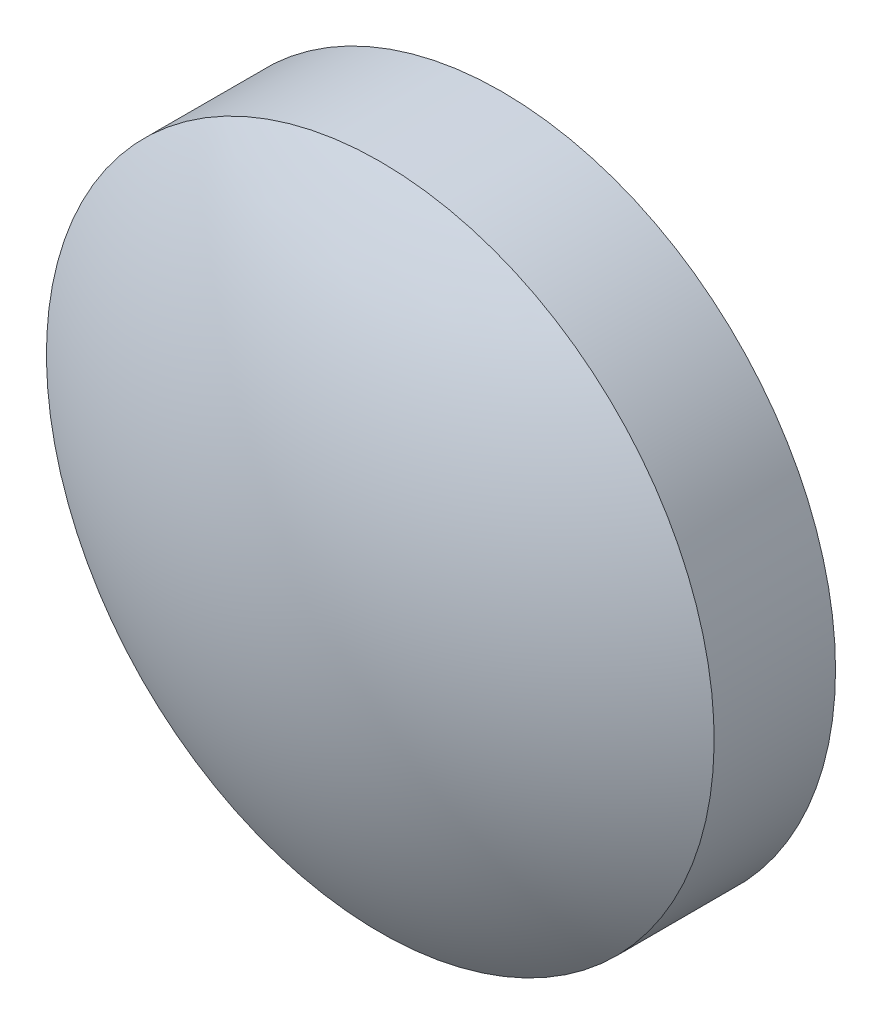
ISO-10303-21;
HEADER;
FILE_DESCRIPTION(('STEP AP214'),'2;1');
FILE_NAME('part.step','',(''),(''),'','','');
FILE_SCHEMA(('AUTOMOTIVE_DESIGN { 1 0 10303 214 1 1 1 1 }'));
ENDSEC;
DATA;
#1=APPLICATION_CONTEXT('core data for automotive mechanical design processes');
#2=APPLICATION_PROTOCOL_DEFINITION('international standard','automotive_design',2000,#1);
#3=PRODUCT_CONTEXT('',#1,'mechanical');
#4=PRODUCT('Part','Part','',(#3));
#5=PRODUCT_RELATED_PRODUCT_CATEGORY('part','',(#4));
#6=PRODUCT_DEFINITION_FORMATION('','',#4);
#7=PRODUCT_DEFINITION_CONTEXT('part definition',#1,'design');
#8=PRODUCT_DEFINITION('design','',#6,#7);
#9=PRODUCT_DEFINITION_SHAPE('','',#8);
#10=(LENGTH_UNIT() NAMED_UNIT(*) SI_UNIT(.MILLI.,.METRE.));
#11=(NAMED_UNIT(*) PLANE_ANGLE_UNIT() SI_UNIT($,.RADIAN.));
#12=(NAMED_UNIT(*) SI_UNIT($,.STERADIAN.) SOLID_ANGLE_UNIT());
#13=UNCERTAINTY_MEASURE_WITH_UNIT(LENGTH_MEASURE(1.E-05),#10,'distance_accuracy_value','');
#14=(GEOMETRIC_REPRESENTATION_CONTEXT(3) GLOBAL_UNCERTAINTY_ASSIGNED_CONTEXT((#13)) GLOBAL_UNIT_ASSIGNED_CONTEXT((#10,
#11,#12)) REPRESENTATION_CONTEXT('',''));
#15=CARTESIAN_POINT('',(0.,0.,0.));
#16=DIRECTION('',(0.,0.,1.));
#17=DIRECTION('',(1.,0.,0.));
#18=AXIS2_PLACEMENT_3D('',#15,#16,#17);
#19=CARTESIAN_POINT('',(0.,0.,3.67582327212251));
#20=DIRECTION('',(0.,0.,-1.));
#21=DIRECTION('',(0.,-1.,0.));
#22=AXIS2_PLACEMENT_3D('',#19,#20,#21);
#23=SPHERICAL_SURFACE('',#22,5.);
#24=CARTESIAN_POINT('',(0.,0.,-0.5));
#25=DIRECTION('',(0.,0.,-1.));
#26=DIRECTION('',(0.,1.,0.));
#27=AXIS2_PLACEMENT_3D('',#24,#25,#26);
#28=CIRCLE('',#27,2.75);
#29=CARTESIAN_POINT('',(0.,2.75,-0.5));
#30=VERTEX_POINT('',#29);
#31=EDGE_CURVE('E10',#30,#30,#28,.T.);
#32=ORIENTED_EDGE('',*,*,#31,.T.);
#33=EDGE_LOOP('',(#32));
#34=FACE_BOUND('',#33,.T.);
#35=ADVANCED_FACE('F40',(#34),#23,.T.);
#36=CARTESIAN_POINT('',(0.,0.,0.));
#37=DIRECTION('',(0.,0.,-1.));
#38=DIRECTION('',(0.,1.,0.));
#39=AXIS2_PLACEMENT_3D('',#36,#37,#38);
#40=CYLINDRICAL_SURFACE('',#39,2.75);
#41=ORIENTED_EDGE('',*,*,#31,.F.);
#42=EDGE_LOOP('',(#41));
#43=FACE_BOUND('',#42,.T.);
#44=CARTESIAN_POINT('',(0.,0.,0.5));
#45=DIRECTION('',(0.,0.,-1.));
#46=DIRECTION('',(0.,1.,0.));
#47=AXIS2_PLACEMENT_3D('',#44,#45,#46);
#48=CIRCLE('',#47,2.75);
#49=CARTESIAN_POINT('',(0.,2.75,0.5));
#50=VERTEX_POINT('',#49);
#51=EDGE_CURVE('E46',#50,#50,#48,.T.);
#52=ORIENTED_EDGE('',*,*,#51,.T.);
#53=EDGE_LOOP('',(#52));
#54=FACE_BOUND('',#53,.T.);
#55=ADVANCED_FACE('F52',(#43,#54),#40,.T.);
#56=CARTESIAN_POINT('',(0.,0.,-3.67582327212251));
#57=DIRECTION('',(0.,0.,-1.));
#58=DIRECTION('',(0.,1.,0.));
#59=AXIS2_PLACEMENT_3D('',#56,#57,#58);
#60=SPHERICAL_SURFACE('',#59,5.);
#61=ORIENTED_EDGE('',*,*,#51,.F.);
#62=EDGE_LOOP('',(#61));
#63=FACE_BOUND('',#62,.T.);
#64=ADVANCED_FACE('F54',(#63),#60,.T.);
#65=CLOSED_SHELL('',(#35,#55,#64));
#66=MANIFOLD_SOLID_BREP('B2',#65);
#67=ADVANCED_BREP_SHAPE_REPRESENTATION('',(#18,#66),#14);
#68=SHAPE_DEFINITION_REPRESENTATION(#9,#67);
ENDSEC;
END-ISO-10303-21;
